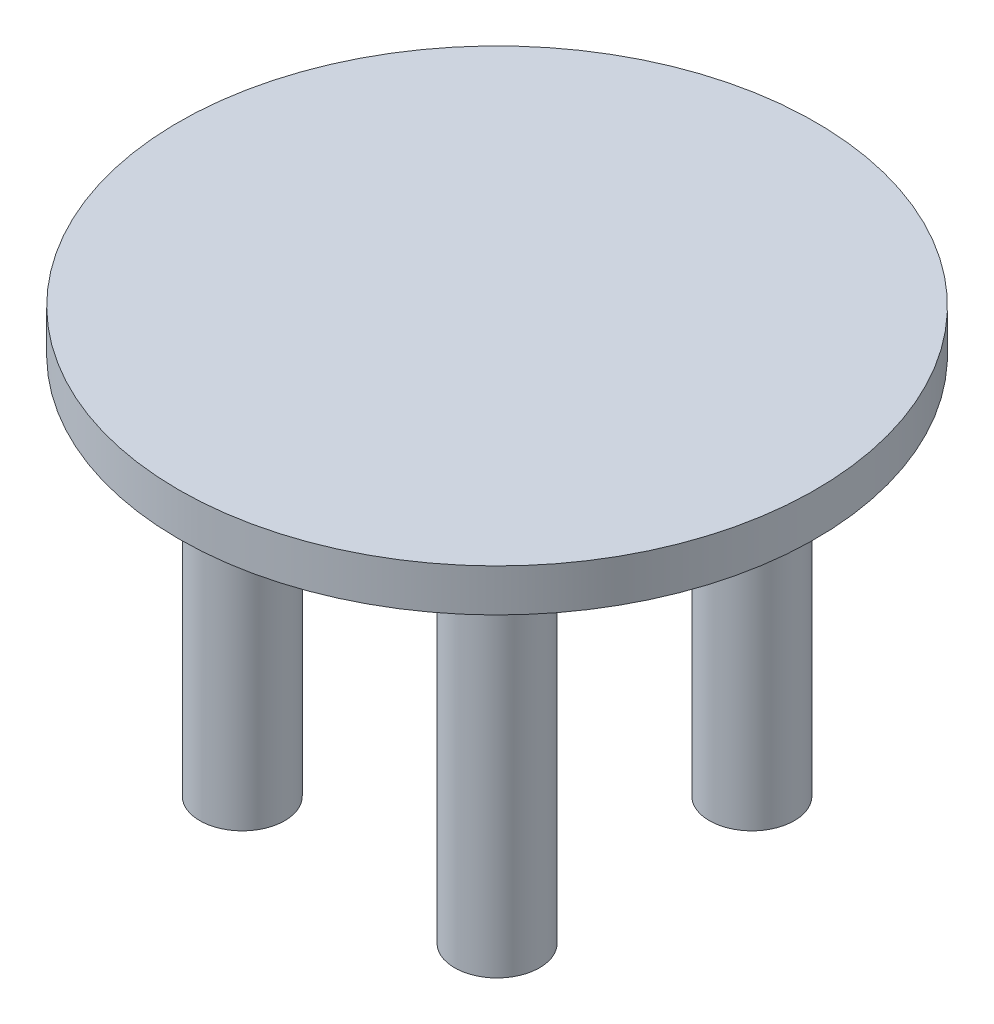
ISO-10303-21;
HEADER;
FILE_DESCRIPTION(('STEP AP214'),'2;1');
FILE_NAME('part.step','',(''),(''),'','','');
FILE_SCHEMA(('AUTOMOTIVE_DESIGN { 1 0 10303 214 1 1 1 1 }'));
ENDSEC;
DATA;
#1=APPLICATION_CONTEXT('core data for automotive mechanical design processes');
#2=APPLICATION_PROTOCOL_DEFINITION('international standard','automotive_design',2000,#1);
#3=PRODUCT_CONTEXT('',#1,'mechanical');
#4=PRODUCT('Part','Part','',(#3));
#5=PRODUCT_RELATED_PRODUCT_CATEGORY('part','',(#4));
#6=PRODUCT_DEFINITION_FORMATION('','',#4);
#7=PRODUCT_DEFINITION_CONTEXT('part definition',#1,'design');
#8=PRODUCT_DEFINITION('design','',#6,#7);
#9=PRODUCT_DEFINITION_SHAPE('','',#8);
#10=(LENGTH_UNIT() NAMED_UNIT(*) SI_UNIT(.MILLI.,.METRE.));
#11=(NAMED_UNIT(*) PLANE_ANGLE_UNIT() SI_UNIT($,.RADIAN.));
#12=(NAMED_UNIT(*) SI_UNIT($,.STERADIAN.) SOLID_ANGLE_UNIT());
#13=UNCERTAINTY_MEASURE_WITH_UNIT(LENGTH_MEASURE(1.E-05),#10,'distance_accuracy_value','');
#14=(GEOMETRIC_REPRESENTATION_CONTEXT(3) GLOBAL_UNCERTAINTY_ASSIGNED_CONTEXT((#13)) GLOBAL_UNIT_ASSIGNED_CONTEXT((#10,
#11,#12)) REPRESENTATION_CONTEXT('',''));
#15=CARTESIAN_POINT('',(0.,0.,0.));
#16=DIRECTION('',(0.,0.,1.));
#17=DIRECTION('',(1.,0.,0.));
#18=AXIS2_PLACEMENT_3D('',#15,#16,#17);
#19=CARTESIAN_POINT('',(30.,100.,-30.));
#20=DIRECTION('',(0.,-1.,0.));
#21=DIRECTION('',(0.,0.,-1.));
#22=AXIS2_PLACEMENT_3D('',#19,#20,#21);
#23=CYLINDRICAL_SURFACE('',#22,9.99999999999999);
#24=CARTESIAN_POINT('',(30.,0.,-30.));
#25=DIRECTION('',(0.,1.,0.));
#26=DIRECTION('',(0.,0.,1.));
#27=AXIS2_PLACEMENT_3D('',#24,#25,#26);
#28=CIRCLE('',#27,9.99999999999999);
#29=CARTESIAN_POINT('',(30.,0.,-20.));
#30=VERTEX_POINT('',#29);
#31=EDGE_CURVE('E72',#30,#30,#28,.T.);
#32=ORIENTED_EDGE('',*,*,#31,.T.);
#33=EDGE_LOOP('',(#32));
#34=FACE_BOUND('',#33,.T.);
#35=CARTESIAN_POINT('',(30.,90.,-30.));
#36=DIRECTION('',(0.,1.,0.));
#37=DIRECTION('',(0.,0.,1.));
#38=AXIS2_PLACEMENT_3D('',#35,#36,#37);
#39=CIRCLE('',#38,9.99999999999999);
#40=CARTESIAN_POINT('',(30.,90.,-20.));
#41=VERTEX_POINT('',#40);
#42=EDGE_CURVE('E40',#41,#41,#39,.T.);
#43=ORIENTED_EDGE('',*,*,#42,.F.);
#44=EDGE_LOOP('',(#43));
#45=FACE_BOUND('',#44,.T.);
#46=ADVANCED_FACE('F37',(#34,#45),#23,.T.);
#47=CARTESIAN_POINT('',(30.,0.,-30.));
#48=DIRECTION('',(0.,1.,0.));
#49=DIRECTION('',(0.,0.,1.));
#50=AXIS2_PLACEMENT_3D('',#47,#48,#49);
#51=PLANE('',#50);
#52=ORIENTED_EDGE('',*,*,#31,.F.);
#53=EDGE_LOOP('',(#52));
#54=FACE_BOUND('',#53,.T.);
#55=ADVANCED_FACE('F87',(#54),#51,.F.);
#56=CARTESIAN_POINT('',(0.,90.,0.));
#57=DIRECTION('',(0.,1.,0.));
#58=DIRECTION('',(0.,0.,1.));
#59=AXIS2_PLACEMENT_3D('',#56,#57,#58);
#60=CYLINDRICAL_SURFACE('',#59,75.);
#61=CARTESIAN_POINT('',(0.,90.,0.));
#62=DIRECTION('',(0.,1.,0.));
#63=DIRECTION('',(0.,0.,1.));
#64=AXIS2_PLACEMENT_3D('',#61,#62,#63);
#65=CIRCLE('',#64,75.);
#66=CARTESIAN_POINT('',(0.,90.,75.));
#67=VERTEX_POINT('',#66);
#68=EDGE_CURVE('E68',#67,#67,#65,.T.);
#69=ORIENTED_EDGE('',*,*,#68,.T.);
#70=EDGE_LOOP('',(#69));
#71=FACE_BOUND('',#70,.T.);
#72=CARTESIAN_POINT('',(0.,100.,0.));
#73=DIRECTION('',(0.,1.,0.));
#74=DIRECTION('',(0.,0.,1.));
#75=AXIS2_PLACEMENT_3D('',#72,#73,#74);
#76=CIRCLE('',#75,75.);
#77=CARTESIAN_POINT('',(0.,100.,75.));
#78=VERTEX_POINT('',#77);
#79=EDGE_CURVE('E64',#78,#78,#76,.T.);
#80=ORIENTED_EDGE('',*,*,#79,.F.);
#81=EDGE_LOOP('',(#80));
#82=FACE_BOUND('',#81,.T.);
#83=ADVANCED_FACE('F91',(#71,#82),#60,.T.);
#84=CARTESIAN_POINT('',(0.,90.,0.));
#85=DIRECTION('',(0.,1.,0.));
#86=DIRECTION('',(0.,0.,1.));
#87=AXIS2_PLACEMENT_3D('',#84,#85,#86);
#88=PLANE('',#87);
#89=CARTESIAN_POINT('',(-30.,90.,-30.));
#90=DIRECTION('',(0.,1.,0.));
#91=DIRECTION('',(0.,0.,1.));
#92=AXIS2_PLACEMENT_3D('',#89,#90,#91);
#93=CIRCLE('',#92,9.99999999999999);
#94=CARTESIAN_POINT('',(-30.,90.,-20.));
#95=VERTEX_POINT('',#94);
#96=EDGE_CURVE('E10',#95,#95,#93,.F.);
#97=ORIENTED_EDGE('',*,*,#96,.F.);
#98=EDGE_LOOP('',(#97));
#99=FACE_BOUND('',#98,.T.);
#100=CARTESIAN_POINT('',(-30.,90.,30.));
#101=DIRECTION('',(0.,1.,0.));
#102=DIRECTION('',(0.,0.,1.));
#103=AXIS2_PLACEMENT_3D('',#100,#101,#102);
#104=CIRCLE('',#103,9.99999999999999);
#105=CARTESIAN_POINT('',(-30.,90.,40.));
#106=VERTEX_POINT('',#105);
#107=EDGE_CURVE('E45',#106,#106,#104,.F.);
#108=ORIENTED_EDGE('',*,*,#107,.F.);
#109=EDGE_LOOP('',(#108));
#110=FACE_BOUND('',#109,.T.);
#111=CARTESIAN_POINT('',(30.,90.,30.));
#112=DIRECTION('',(0.,1.,0.));
#113=DIRECTION('',(0.,0.,1.));
#114=AXIS2_PLACEMENT_3D('',#111,#112,#113);
#115=CIRCLE('',#114,9.99999999999999);
#116=CARTESIAN_POINT('',(30.,90.,40.));
#117=VERTEX_POINT('',#116);
#118=EDGE_CURVE('E51',#117,#117,#115,.F.);
#119=ORIENTED_EDGE('',*,*,#118,.F.);
#120=EDGE_LOOP('',(#119));
#121=FACE_BOUND('',#120,.T.);
#122=ORIENTED_EDGE('',*,*,#42,.T.);
#123=EDGE_LOOP('',(#122));
#124=FACE_BOUND('',#123,.T.);
#125=ORIENTED_EDGE('',*,*,#68,.F.);
#126=EDGE_LOOP('',(#125));
#127=FACE_BOUND('',#126,.T.);
#128=ADVANCED_FACE('F83',(#99,#110,#121,#124,#127),#88,.F.);
#129=CARTESIAN_POINT('',(30.,100.,-30.));
#130=DIRECTION('',(0.,1.,0.));
#131=DIRECTION('',(0.,0.,1.));
#132=AXIS2_PLACEMENT_3D('',#129,#130,#131);
#133=PLANE('',#132);
#134=ORIENTED_EDGE('',*,*,#79,.T.);
#135=EDGE_LOOP('',(#134));
#136=FACE_BOUND('',#135,.T.);
#137=ADVANCED_FACE('F99',(#136),#133,.T.);
#138=CARTESIAN_POINT('',(30.,100.,30.));
#139=DIRECTION('',(0.,-1.,0.));
#140=DIRECTION('',(0.,0.,-1.));
#141=AXIS2_PLACEMENT_3D('',#138,#139,#140);
#142=CYLINDRICAL_SURFACE('',#141,9.99999999999999);
#143=CARTESIAN_POINT('',(30.,0.,30.));
#144=DIRECTION('',(0.,1.,0.));
#145=DIRECTION('',(0.,0.,-1.));
#146=AXIS2_PLACEMENT_3D('',#143,#144,#145);
#147=CIRCLE('',#146,9.99999999999999);
#148=CARTESIAN_POINT('',(30.,0.,20.));
#149=VERTEX_POINT('',#148);
#150=EDGE_CURVE('E59',#149,#149,#147,.T.);
#151=ORIENTED_EDGE('',*,*,#150,.T.);
#152=EDGE_LOOP('',(#151));
#153=FACE_BOUND('',#152,.T.);
#154=ORIENTED_EDGE('',*,*,#118,.T.);
#155=EDGE_LOOP('',(#154));
#156=FACE_BOUND('',#155,.T.);
#157=ADVANCED_FACE('F101',(#153,#156),#142,.T.);
#158=CARTESIAN_POINT('',(30.,0.,30.));
#159=DIRECTION('',(0.,-1.,0.));
#160=DIRECTION('',(0.,0.,-1.));
#161=AXIS2_PLACEMENT_3D('',#158,#159,#160);
#162=PLANE('',#161);
#163=ORIENTED_EDGE('',*,*,#150,.F.);
#164=EDGE_LOOP('',(#163));
#165=FACE_BOUND('',#164,.T.);
#166=ADVANCED_FACE('F109',(#165),#162,.T.);
#167=CARTESIAN_POINT('',(-30.,100.,30.));
#168=DIRECTION('',(0.,-1.,0.));
#169=DIRECTION('',(0.,0.,-1.));
#170=AXIS2_PLACEMENT_3D('',#167,#168,#169);
#171=CYLINDRICAL_SURFACE('',#170,9.99999999999999);
#172=CARTESIAN_POINT('',(-30.,0.,30.));
#173=DIRECTION('',(0.,-1.,0.));
#174=DIRECTION('',(0.,0.,-1.));
#175=AXIS2_PLACEMENT_3D('',#172,#173,#174);
#176=CIRCLE('',#175,9.99999999999999);
#177=CARTESIAN_POINT('',(-30.,0.,20.));
#178=VERTEX_POINT('',#177);
#179=EDGE_CURVE('E56',#178,#178,#176,.T.);
#180=ORIENTED_EDGE('',*,*,#179,.F.);
#181=EDGE_LOOP('',(#180));
#182=FACE_BOUND('',#181,.T.);
#183=ORIENTED_EDGE('',*,*,#107,.T.);
#184=EDGE_LOOP('',(#183));
#185=FACE_BOUND('',#184,.T.);
#186=ADVANCED_FACE('F113',(#182,#185),#171,.T.);
#187=CARTESIAN_POINT('',(-30.,0.,30.));
#188=DIRECTION('',(0.,-1.,0.));
#189=DIRECTION('',(0.,0.,-1.));
#190=AXIS2_PLACEMENT_3D('',#187,#188,#189);
#191=PLANE('',#190);
#192=ORIENTED_EDGE('',*,*,#179,.T.);
#193=EDGE_LOOP('',(#192));
#194=FACE_BOUND('',#193,.T.);
#195=ADVANCED_FACE('F117',(#194),#191,.T.);
#196=CARTESIAN_POINT('',(-30.,100.,-30.));
#197=DIRECTION('',(0.,-1.,0.));
#198=DIRECTION('',(0.,0.,-1.));
#199=AXIS2_PLACEMENT_3D('',#196,#197,#198);
#200=CYLINDRICAL_SURFACE('',#199,9.99999999999999);
#201=CARTESIAN_POINT('',(-30.,0.,-30.));
#202=DIRECTION('',(0.,-1.,0.));
#203=DIRECTION('',(0.,0.,1.));
#204=AXIS2_PLACEMENT_3D('',#201,#202,#203);
#205=CIRCLE('',#204,9.99999999999999);
#206=CARTESIAN_POINT('',(-30.,0.,-20.));
#207=VERTEX_POINT('',#206);
#208=EDGE_CURVE('E55',#207,#207,#205,.T.);
#209=ORIENTED_EDGE('',*,*,#208,.F.);
#210=EDGE_LOOP('',(#209));
#211=FACE_BOUND('',#210,.T.);
#212=ORIENTED_EDGE('',*,*,#96,.T.);
#213=EDGE_LOOP('',(#212));
#214=FACE_BOUND('',#213,.T.);
#215=ADVANCED_FACE('F121',(#211,#214),#200,.T.);
#216=CARTESIAN_POINT('',(-30.,0.,-30.));
#217=DIRECTION('',(0.,1.,0.));
#218=DIRECTION('',(0.,0.,1.));
#219=AXIS2_PLACEMENT_3D('',#216,#217,#218);
#220=PLANE('',#219);
#221=ORIENTED_EDGE('',*,*,#208,.T.);
#222=EDGE_LOOP('',(#221));
#223=FACE_BOUND('',#222,.T.);
#224=ADVANCED_FACE('F125',(#223),#220,.F.);
#225=CLOSED_SHELL('',(#46,#55,#83,#128,#137,#157,#166,#186,#195,#215,#224));
#226=MANIFOLD_SOLID_BREP('B2',#225);
#227=ADVANCED_BREP_SHAPE_REPRESENTATION('',(#18,#226),#14);
#228=SHAPE_DEFINITION_REPRESENTATION(#9,#227);
ENDSEC;
END-ISO-10303-21;
